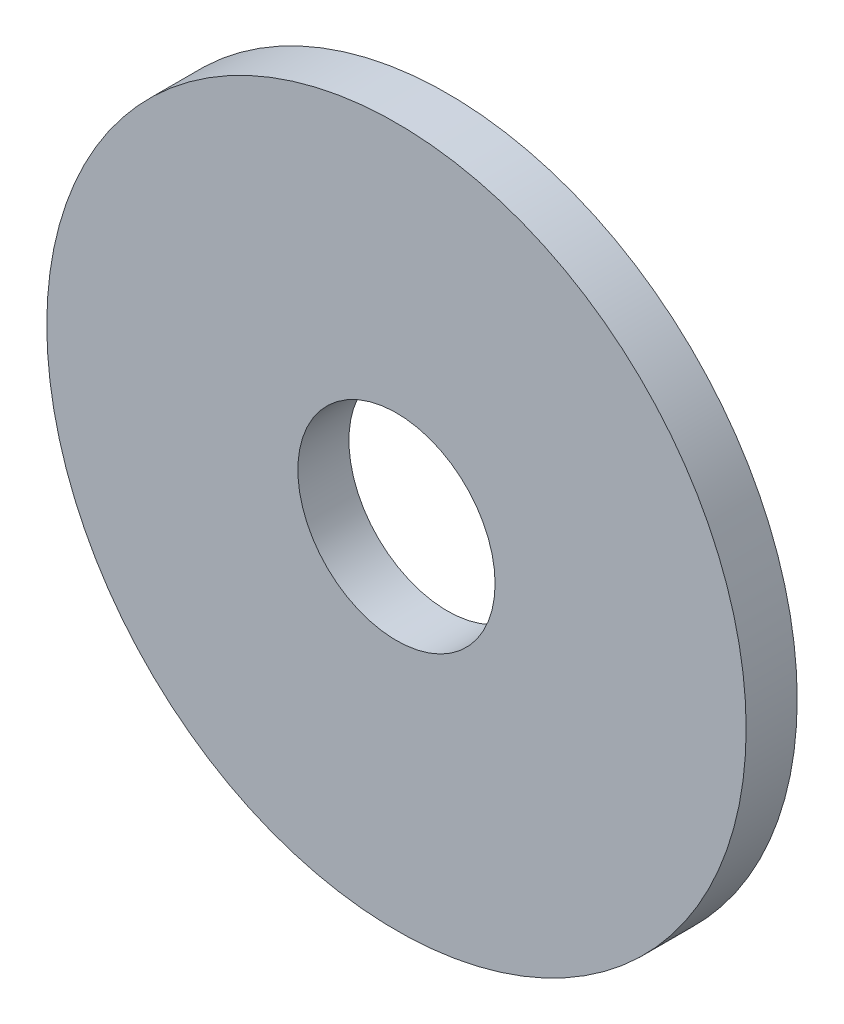
ISO-10303-21;
HEADER;
FILE_DESCRIPTION(('STEP AP214'),'2;1');
FILE_NAME('part.step','',(''),(''),'','','');
FILE_SCHEMA(('AUTOMOTIVE_DESIGN { 1 0 10303 214 1 1 1 1 }'));
ENDSEC;
DATA;
#1=APPLICATION_CONTEXT('core data for automotive mechanical design processes');
#2=APPLICATION_PROTOCOL_DEFINITION('international standard','automotive_design',2000,#1);
#3=PRODUCT_CONTEXT('',#1,'mechanical');
#4=PRODUCT('Part','Part','',(#3));
#5=PRODUCT_RELATED_PRODUCT_CATEGORY('part','',(#4));
#6=PRODUCT_DEFINITION_FORMATION('','',#4);
#7=PRODUCT_DEFINITION_CONTEXT('part definition',#1,'design');
#8=PRODUCT_DEFINITION('design','',#6,#7);
#9=PRODUCT_DEFINITION_SHAPE('','',#8);
#10=(LENGTH_UNIT() NAMED_UNIT(*) SI_UNIT(.MILLI.,.METRE.));
#11=(NAMED_UNIT(*) PLANE_ANGLE_UNIT() SI_UNIT($,.RADIAN.));
#12=(NAMED_UNIT(*) SI_UNIT($,.STERADIAN.) SOLID_ANGLE_UNIT());
#13=UNCERTAINTY_MEASURE_WITH_UNIT(LENGTH_MEASURE(1.E-05),#10,'distance_accuracy_value','');
#14=(GEOMETRIC_REPRESENTATION_CONTEXT(3) GLOBAL_UNCERTAINTY_ASSIGNED_CONTEXT((#13)) GLOBAL_UNIT_ASSIGNED_CONTEXT((#10,
#11,#12)) REPRESENTATION_CONTEXT('',''));
#15=CARTESIAN_POINT('',(0.,0.,0.));
#16=DIRECTION('',(0.,0.,1.));
#17=DIRECTION('',(1.,0.,0.));
#18=AXIS2_PLACEMENT_3D('',#15,#16,#17);
#19=CARTESIAN_POINT('',(0.,0.,0.463549999999994));
#20=DIRECTION('',(0.,0.,1.));
#21=DIRECTION('',(1.,0.,0.));
#22=AXIS2_PLACEMENT_3D('',#19,#20,#21);
#23=PLANE('',#22);
#24=CARTESIAN_POINT('',(0.,0.,0.463549999999994));
#25=DIRECTION('',(0.,0.,1.));
#26=DIRECTION('',(1.,0.,0.));
#27=AXIS2_PLACEMENT_3D('',#24,#25,#26);
#28=CIRCLE('',#27,6.35);
#29=CARTESIAN_POINT('',(6.35,0.,0.463549999999994));
#30=VERTEX_POINT('',#29);
#31=EDGE_CURVE('E10',#30,#30,#28,.T.);
#32=ORIENTED_EDGE('',*,*,#31,.T.);
#33=EDGE_LOOP('',(#32));
#34=FACE_BOUND('',#33,.T.);
#35=CARTESIAN_POINT('',(0.,0.,0.463549999999994));
#36=DIRECTION('',(0.,0.,1.));
#37=DIRECTION('',(1.,0.,0.));
#38=AXIS2_PLACEMENT_3D('',#35,#36,#37);
#39=CIRCLE('',#38,1.7907);
#40=CARTESIAN_POINT('',(1.7907,0.,0.463549999999994));
#41=VERTEX_POINT('',#40);
#42=EDGE_CURVE('E44',#41,#41,#39,.T.);
#43=ORIENTED_EDGE('',*,*,#42,.F.);
#44=EDGE_LOOP('',(#43));
#45=FACE_BOUND('',#44,.T.);
#46=ADVANCED_FACE('F37',(#34,#45),#23,.T.);
#47=CARTESIAN_POINT('',(0.,0.,0.463549999999994));
#48=DIRECTION('',(0.,0.,-1.));
#49=DIRECTION('',(-1.,0.,0.));
#50=AXIS2_PLACEMENT_3D('',#47,#48,#49);
#51=CYLINDRICAL_SURFACE('',#50,6.35);
#52=ORIENTED_EDGE('',*,*,#31,.F.);
#53=EDGE_LOOP('',(#52));
#54=FACE_BOUND('',#53,.T.);
#55=CARTESIAN_POINT('',(0.,0.,-0.463550000000006));
#56=DIRECTION('',(0.,0.,1.));
#57=DIRECTION('',(1.,0.,0.));
#58=AXIS2_PLACEMENT_3D('',#55,#56,#57);
#59=CIRCLE('',#58,6.35);
#60=CARTESIAN_POINT('',(6.35,0.,-0.463550000000006));
#61=VERTEX_POINT('',#60);
#62=EDGE_CURVE('E48',#61,#61,#59,.T.);
#63=ORIENTED_EDGE('',*,*,#62,.T.);
#64=EDGE_LOOP('',(#63));
#65=FACE_BOUND('',#64,.T.);
#66=ADVANCED_FACE('F39',(#54,#65),#51,.T.);
#67=CARTESIAN_POINT('',(0.,0.,0.463549999999994));
#68=DIRECTION('',(0.,0.,-1.));
#69=DIRECTION('',(-1.,0.,0.));
#70=AXIS2_PLACEMENT_3D('',#67,#68,#69);
#71=CYLINDRICAL_SURFACE('',#70,1.7907);
#72=ORIENTED_EDGE('',*,*,#42,.T.);
#73=EDGE_LOOP('',(#72));
#74=FACE_BOUND('',#73,.T.);
#75=CARTESIAN_POINT('',(0.,0.,-0.463550000000006));
#76=DIRECTION('',(0.,0.,1.));
#77=DIRECTION('',(1.,0.,0.));
#78=AXIS2_PLACEMENT_3D('',#75,#76,#77);
#79=CIRCLE('',#78,1.7907);
#80=CARTESIAN_POINT('',(1.7907,0.,-0.463550000000006));
#81=VERTEX_POINT('',#80);
#82=EDGE_CURVE('E52',#81,#81,#79,.T.);
#83=ORIENTED_EDGE('',*,*,#82,.F.);
#84=EDGE_LOOP('',(#83));
#85=FACE_BOUND('',#84,.T.);
#86=ADVANCED_FACE('F61',(#74,#85),#71,.F.);
#87=CARTESIAN_POINT('',(0.,0.,-0.463550000000006));
#88=DIRECTION('',(0.,0.,1.));
#89=DIRECTION('',(1.,0.,0.));
#90=AXIS2_PLACEMENT_3D('',#87,#88,#89);
#91=PLANE('',#90);
#92=ORIENTED_EDGE('',*,*,#82,.T.);
#93=EDGE_LOOP('',(#92));
#94=FACE_BOUND('',#93,.T.);
#95=ORIENTED_EDGE('',*,*,#62,.F.);
#96=EDGE_LOOP('',(#95));
#97=FACE_BOUND('',#96,.T.);
#98=ADVANCED_FACE('F58',(#94,#97),#91,.F.);
#99=CLOSED_SHELL('',(#46,#66,#86,#98));
#100=MANIFOLD_SOLID_BREP('B2',#99);
#101=ADVANCED_BREP_SHAPE_REPRESENTATION('',(#18,#100),#14);
#102=SHAPE_DEFINITION_REPRESENTATION(#9,#101);
ENDSEC;
END-ISO-10303-21;
